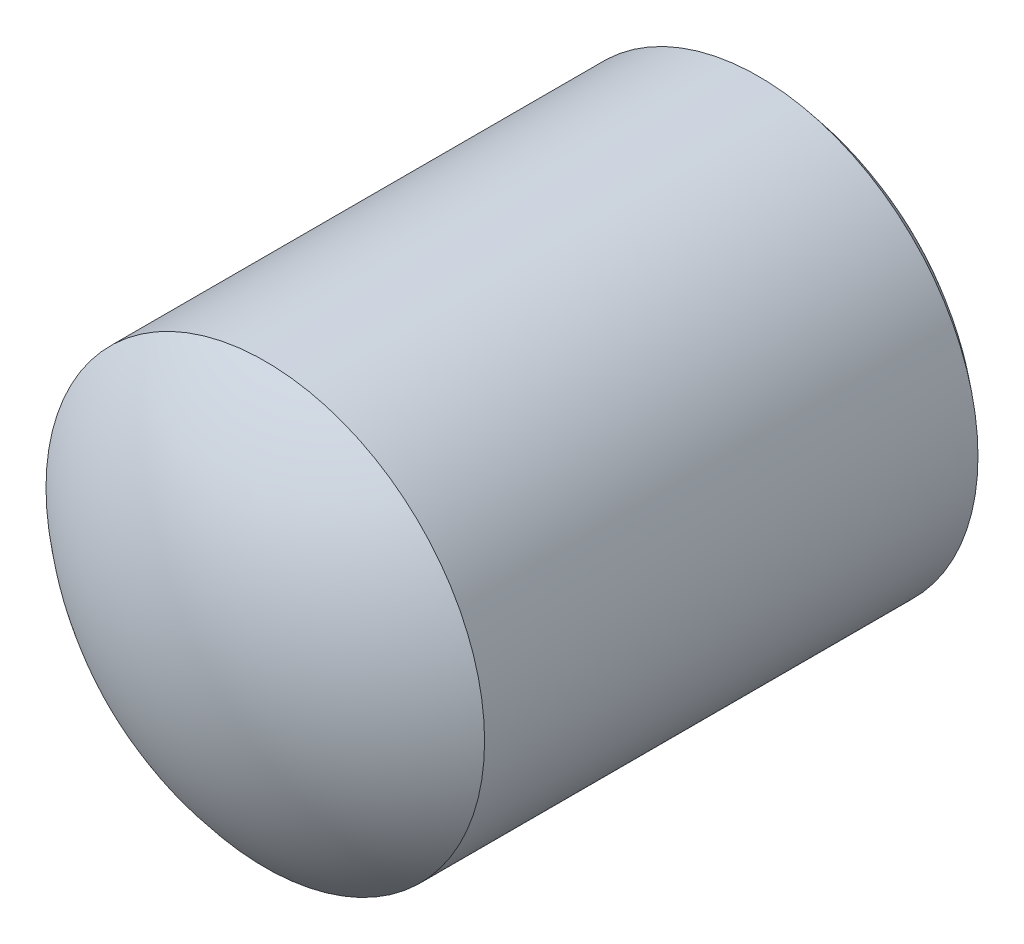
ISO-10303-21;
HEADER;
FILE_DESCRIPTION(('STEP AP214'),'2;1');
FILE_NAME('part.step','',(''),(''),'','','');
FILE_SCHEMA(('AUTOMOTIVE_DESIGN { 1 0 10303 214 1 1 1 1 }'));
ENDSEC;
DATA;
#1=APPLICATION_CONTEXT('core data for automotive mechanical design processes');
#2=APPLICATION_PROTOCOL_DEFINITION('international standard','automotive_design',2000,#1);
#3=PRODUCT_CONTEXT('',#1,'mechanical');
#4=PRODUCT('Part','Part','',(#3));
#5=PRODUCT_RELATED_PRODUCT_CATEGORY('part','',(#4));
#6=PRODUCT_DEFINITION_FORMATION('','',#4);
#7=PRODUCT_DEFINITION_CONTEXT('part definition',#1,'design');
#8=PRODUCT_DEFINITION('design','',#6,#7);
#9=PRODUCT_DEFINITION_SHAPE('','',#8);
#10=(LENGTH_UNIT() NAMED_UNIT(*) SI_UNIT(.MILLI.,.METRE.));
#11=(NAMED_UNIT(*) PLANE_ANGLE_UNIT() SI_UNIT($,.RADIAN.));
#12=(NAMED_UNIT(*) SI_UNIT($,.STERADIAN.) SOLID_ANGLE_UNIT());
#13=UNCERTAINTY_MEASURE_WITH_UNIT(LENGTH_MEASURE(1.E-05),#10,'distance_accuracy_value','');
#14=(GEOMETRIC_REPRESENTATION_CONTEXT(3) GLOBAL_UNCERTAINTY_ASSIGNED_CONTEXT((#13)) GLOBAL_UNIT_ASSIGNED_CONTEXT((#10,
#11,#12)) REPRESENTATION_CONTEXT('',''));
#15=CARTESIAN_POINT('',(0.,0.,0.));
#16=DIRECTION('',(0.,0.,1.));
#17=DIRECTION('',(1.,0.,0.));
#18=AXIS2_PLACEMENT_3D('',#15,#16,#17);
#19=CARTESIAN_POINT('',(0.,0.,900.));
#20=DIRECTION('',(0.,0.,-1.));
#21=DIRECTION('',(-1.,0.,0.));
#22=AXIS2_PLACEMENT_3D('',#19,#20,#21);
#23=CYLINDRICAL_SURFACE('',#22,400.);
#24=CARTESIAN_POINT('',(0.,0.,900.));
#25=DIRECTION('',(0.,0.,1.));
#26=DIRECTION('',(1.,0.,0.));
#27=AXIS2_PLACEMENT_3D('',#24,#25,#26);
#28=CIRCLE('',#27,400.);
#29=CARTESIAN_POINT('',(400.,0.,900.));
#30=VERTEX_POINT('',#29);
#31=EDGE_CURVE('E10',#30,#30,#28,.T.);
#32=ORIENTED_EDGE('',*,*,#31,.F.);
#33=EDGE_LOOP('',(#32));
#34=FACE_BOUND('',#33,.T.);
#35=CARTESIAN_POINT('',(0.,0.,0.));
#36=DIRECTION('',(0.,0.,1.));
#37=DIRECTION('',(1.,0.,0.));
#38=AXIS2_PLACEMENT_3D('',#35,#36,#37);
#39=CIRCLE('',#38,400.);
#40=CARTESIAN_POINT('',(400.,0.,0.));
#41=VERTEX_POINT('',#40);
#42=EDGE_CURVE('E41',#41,#41,#39,.T.);
#43=ORIENTED_EDGE('',*,*,#42,.T.);
#44=EDGE_LOOP('',(#43));
#45=FACE_BOUND('',#44,.T.);
#46=ADVANCED_FACE('F37',(#34,#45),#23,.T.);
#47=CARTESIAN_POINT('',(0.,0.,441.666666666667));
#48=DIRECTION('',(0.,0.,1.));
#49=DIRECTION('',(1.,0.,0.));
#50=AXIS2_PLACEMENT_3D('',#47,#48,#49);
#51=SPHERICAL_SURFACE('',#50,608.333333333333);
#52=ORIENTED_EDGE('',*,*,#31,.T.);
#53=EDGE_LOOP('',(#52));
#54=FACE_BOUND('',#53,.T.);
#55=ADVANCED_FACE('F54',(#54),#51,.T.);
#56=CARTESIAN_POINT('',(0.,0.,458.333333333333));
#57=DIRECTION('',(0.,0.,1.));
#58=DIRECTION('',(1.,0.,0.));
#59=AXIS2_PLACEMENT_3D('',#56,#57,#58);
#60=SPHERICAL_SURFACE('',#59,608.333333333333);
#61=ORIENTED_EDGE('',*,*,#42,.F.);
#62=EDGE_LOOP('',(#61));
#63=FACE_BOUND('',#62,.T.);
#64=ADVANCED_FACE('F39',(#63),#60,.T.);
#65=CLOSED_SHELL('',(#46,#55,#64));
#66=MANIFOLD_SOLID_BREP('B2',#65);
#67=ADVANCED_BREP_SHAPE_REPRESENTATION('',(#18,#66),#14);
#68=SHAPE_DEFINITION_REPRESENTATION(#9,#67);
ENDSEC;
END-ISO-10303-21;
